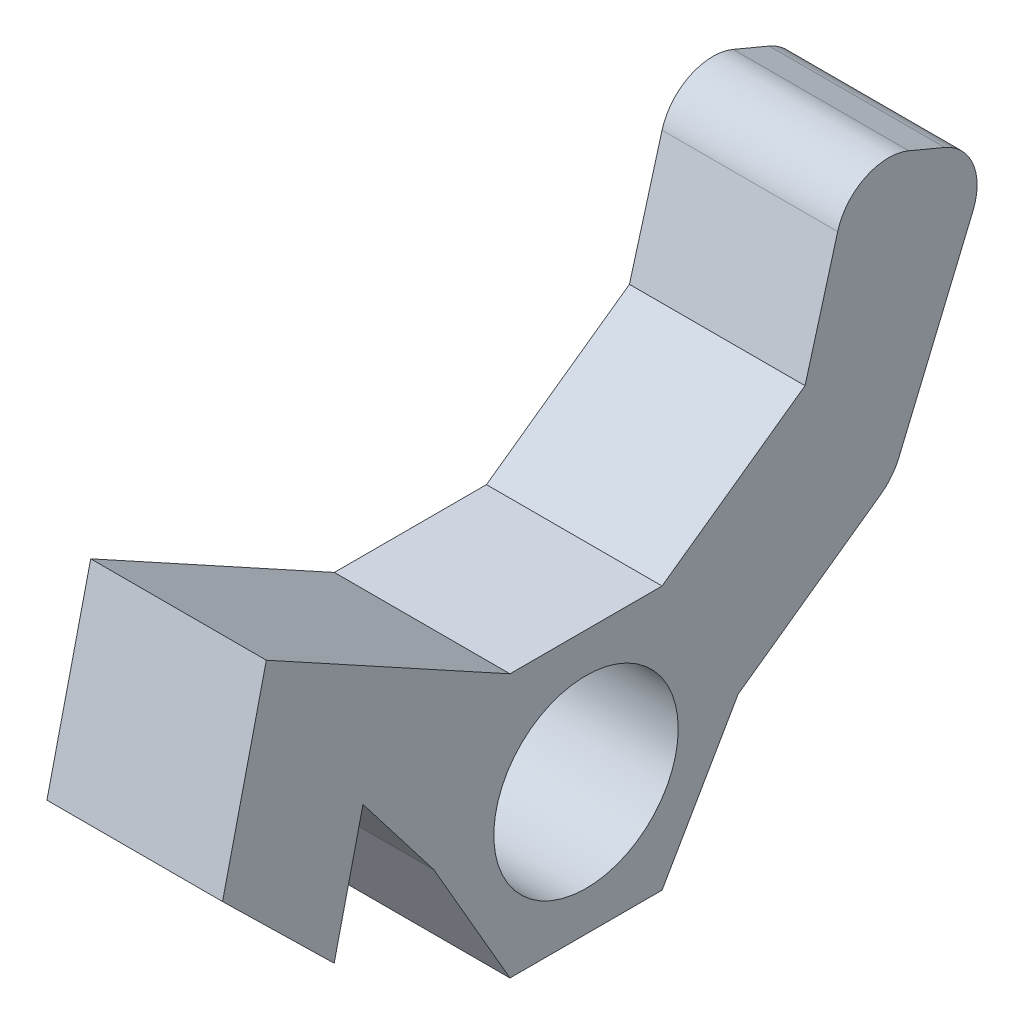
ISO-10303-21;
HEADER;
FILE_DESCRIPTION(('STEP AP214'),'2;1');
FILE_NAME('part.step','',(''),(''),'','','');
FILE_SCHEMA(('AUTOMOTIVE_DESIGN { 1 0 10303 214 1 1 1 1 }'));
ENDSEC;
DATA;
#1=APPLICATION_CONTEXT('core data for automotive mechanical design processes');
#2=APPLICATION_PROTOCOL_DEFINITION('international standard','automotive_design',2000,#1);
#3=PRODUCT_CONTEXT('',#1,'mechanical');
#4=PRODUCT('Part','Part','',(#3));
#5=PRODUCT_RELATED_PRODUCT_CATEGORY('part','',(#4));
#6=PRODUCT_DEFINITION_FORMATION('','',#4);
#7=PRODUCT_DEFINITION_CONTEXT('part definition',#1,'design');
#8=PRODUCT_DEFINITION('design','',#6,#7);
#9=PRODUCT_DEFINITION_SHAPE('','',#8);
#10=(LENGTH_UNIT() NAMED_UNIT(*) SI_UNIT(.MILLI.,.METRE.));
#11=(NAMED_UNIT(*) PLANE_ANGLE_UNIT() SI_UNIT($,.RADIAN.));
#12=(NAMED_UNIT(*) SI_UNIT($,.STERADIAN.) SOLID_ANGLE_UNIT());
#13=UNCERTAINTY_MEASURE_WITH_UNIT(LENGTH_MEASURE(1.E-05),#10,'distance_accuracy_value','');
#14=(GEOMETRIC_REPRESENTATION_CONTEXT(3) GLOBAL_UNCERTAINTY_ASSIGNED_CONTEXT((#13)) GLOBAL_UNIT_ASSIGNED_CONTEXT((#10,
#11,#12)) REPRESENTATION_CONTEXT('',''));
#15=CARTESIAN_POINT('',(0.,0.,0.));
#16=DIRECTION('',(0.,0.,1.));
#17=DIRECTION('',(1.,0.,0.));
#18=AXIS2_PLACEMENT_3D('',#15,#16,#17);
#19=CARTESIAN_POINT('',(4.,0.,0.));
#20=DIRECTION('',(1.,0.,0.));
#21=DIRECTION('',(0.,0.,-1.));
#22=AXIS2_PLACEMENT_3D('',#19,#20,#21);
#23=PLANE('',#22);
#24=DIRECTION('',(0.,-0.580651326789798,0.814152342437978));
#25=VECTOR('',#24,1.);
#26=CARTESIAN_POINT('',(4.,-1.63761467889908,-1.16794251703039));
#27=LINE('',#26,#25);
#28=CARTESIAN_POINT('',(4.,2.31721094970196,-6.71314736011672));
#29=VERTEX_POINT('',#28);
#30=CARTESIAN_POINT('',(4.,0.,-3.46410161513775));
#31=VERTEX_POINT('',#30);
#32=EDGE_CURVE('E177',#29,#31,#27,.T.);
#33=ORIENTED_EDGE('',*,*,#32,.F.);
#34=CARTESIAN_POINT('',(4.,3.29419376062754,-6.01636576796896));
#35=DIRECTION('',(1.,0.,0.));
#36=DIRECTION('',(0.,0.,-1.));
#37=AXIS2_PLACEMENT_3D('',#34,#35,#36);
#38=CIRCLE('',#37,1.2);
#39=CARTESIAN_POINT('',(4.,2.82977688229042,-7.12285434139193));
#40=VERTEX_POINT('',#39);
#41=EDGE_CURVE('E232',#29,#40,#38,.T.);
#42=ORIENTED_EDGE('',*,*,#41,.T.);
#43=DIRECTION('',(0.,0.922073811185813,-0.387014065280928));
#44=VECTOR('',#43,1.);
#45=CARTESIAN_POINT('',(4.,2.51526585761791,-6.99084734937289));
#46=LINE('',#45,#44);
#47=CARTESIAN_POINT('',(4.,6.85967567406385,-8.81428890460679));
#48=VERTEX_POINT('',#47);
#49=EDGE_CURVE('E251',#40,#48,#46,.T.);
#50=ORIENTED_EDGE('',*,*,#49,.T.);
#51=CARTESIAN_POINT('',(4.,7.32409255240096,-7.70780033118382));
#52=DIRECTION('',(1.,0.,0.));
#53=DIRECTION('',(0.,0.,-1.));
#54=AXIS2_PLACEMENT_3D('',#51,#52,#53);
#55=CIRCLE('',#54,1.2);
#56=CARTESIAN_POINT('',(4.,8.43058112582394,-8.17221720952093));
#57=VERTEX_POINT('',#56);
#58=EDGE_CURVE('E230',#48,#57,#55,.T.);
#59=ORIENTED_EDGE('',*,*,#58,.T.);
#60=DIRECTION('',(0.,0.387014065280928,0.922073811185813));
#61=VECTOR('',#60,1.);
#62=CARTESIAN_POINT('',(4.,7.96616424748682,-9.27870578294391));
#63=LINE('',#62,#61);
#64=CARTESIAN_POINT('',(4.,8.77462665925595,-7.35251734666754));
#65=VERTEX_POINT('',#64);
#66=EDGE_CURVE('E167',#57,#65,#63,.T.);
#67=ORIENTED_EDGE('',*,*,#66,.T.);
#68=CARTESIAN_POINT('',(4.,7.66813808583297,-6.88810046833043));
#69=DIRECTION('',(1.,0.,0.));
#70=DIRECTION('',(0.,0.,-1.));
#71=AXIS2_PLACEMENT_3D('',#68,#69,#70);
#72=CIRCLE('',#71,1.2);
#73=CARTESIAN_POINT('',(4.,7.99030331336445,-5.73215515553678));
#74=VERTEX_POINT('',#73);
#75=EDGE_CURVE('E162',#65,#74,#72,.T.);
#76=ORIENTED_EDGE('',*,*,#75,.T.);
#77=DIRECTION('',(0.,-0.963287760661368,0.268471022942901));
#78=VECTOR('',#77,1.);
#79=CARTESIAN_POINT('',(4.,9.30136277270602,-6.09755113435285));
#80=LINE('',#79,#78);
#81=CARTESIAN_POINT('',(4.,5.3226053071592,-4.98866017732079));
#82=VERTEX_POINT('',#81);
#83=EDGE_CURVE('E156',#74,#82,#80,.T.);
#84=ORIENTED_EDGE('',*,*,#83,.T.);
#85=DIRECTION('',(0.,0.580651326789799,-0.814152342437978));
#86=VECTOR('',#85,1.);
#87=CARTESIAN_POINT('',(4.,1.1697247706422,0.834244655021708));
#88=LINE('',#87,#86);
#89=CARTESIAN_POINT('',(4.,3.,-1.73205080756888));
#90=VERTEX_POINT('',#89);
#91=EDGE_CURVE('E160',#90,#82,#88,.T.);
#92=ORIENTED_EDGE('',*,*,#91,.F.);
#93=DIRECTION('',(0.,0.,1.));
#94=VECTOR('',#93,1.);
#95=CARTESIAN_POINT('',(4.,3.,-1.73205080756888));
#96=LINE('',#95,#94);
#97=CARTESIAN_POINT('',(4.,3.,1.73205080756888));
#98=VERTEX_POINT('',#97);
#99=EDGE_CURVE('E197',#90,#98,#96,.T.);
#100=ORIENTED_EDGE('',*,*,#99,.T.);
#101=DIRECTION('',(0.,-0.480833999578843,-0.876811647304604));
#102=VECTOR('',#101,1.);
#103=CARTESIAN_POINT('',(4.,1.57616189966639,-0.864350094493091));
#104=LINE('',#103,#102);
#105=CARTESIAN_POINT('',(4.,6.04314808135633,7.28129999656755));
#106=VERTEX_POINT('',#105);
#107=EDGE_CURVE('E269',#106,#98,#104,.T.);
#108=ORIENTED_EDGE('',*,*,#107,.F.);
#109=DIRECTION('',(0.,0.973692519233933,-0.227865921076139));
#110=VECTOR('',#109,1.);
#111=CARTESIAN_POINT('',(4.,1.9292894476235,8.24403532444095));
#112=LINE('',#111,#110);
#113=CARTESIAN_POINT('',(4.,1.78076467336461,8.27879345785637));
#114=VERTEX_POINT('',#113);
#115=EDGE_CURVE('E272',#114,#106,#112,.T.);
#116=ORIENTED_EDGE('',*,*,#115,.F.);
#117=DIRECTION('',(0.,0.699271931018906,0.71485576621378));
#118=VECTOR('',#117,1.);
#119=CARTESIAN_POINT('',(4.,-3.22838728513977,3.15800853494332));
#120=LINE('',#119,#118);
#121=CARTESIAN_POINT('',(4.,-0.70638785207229,5.73621274584197));
#122=VERTEX_POINT('',#121);
#123=EDGE_CURVE('E274',#122,#114,#120,.T.);
#124=ORIENTED_EDGE('',*,*,#123,.F.);
#125=DIRECTION('',(0.,-0.973692519233933,0.227865921076139));
#126=VECTOR('',#125,1.);
#127=CARTESIAN_POINT('',(4.,1.23602353390806,5.28164485009247));
#128=LINE('',#127,#126);
#129=CARTESIAN_POINT('',(4.,2.09763278058422,5.08000893246619));
#130=VERTEX_POINT('',#129);
#131=EDGE_CURVE('E276',#130,#122,#128,.T.);
#132=ORIENTED_EDGE('',*,*,#131,.F.);
#133=DIRECTION('',(0.,0.792196048817041,0.610266679607095));
#134=VECTOR('',#133,1.);
#135=CARTESIAN_POINT('',(4.,-1.67472287832484,2.17398211537063));
#136=LINE('',#135,#134);
#137=CARTESIAN_POINT('',(4.,0.,3.46410161513776));
#138=VERTEX_POINT('',#137);
#139=EDGE_CURVE('E260',#138,#130,#136,.T.);
#140=ORIENTED_EDGE('',*,*,#139,.F.);
#141=DIRECTION('',(0.,-0.866025403784439,-0.5));
#142=VECTOR('',#141,1.);
#143=CARTESIAN_POINT('',(4.,0.,3.46410161513776));
#144=LINE('',#143,#142);
#145=CARTESIAN_POINT('',(4.,-3.,1.73205080756888));
#146=VERTEX_POINT('',#145);
#147=EDGE_CURVE('E200',#138,#146,#144,.T.);
#148=ORIENTED_EDGE('',*,*,#147,.T.);
#149=DIRECTION('',(0.,0.,-1.));
#150=VECTOR('',#149,1.);
#151=CARTESIAN_POINT('',(4.,-3.,1.73205080756888));
#152=LINE('',#151,#150);
#153=CARTESIAN_POINT('',(4.,-3.,-1.73205080756888));
#154=VERTEX_POINT('',#153);
#155=EDGE_CURVE('E202',#146,#154,#152,.T.);
#156=ORIENTED_EDGE('',*,*,#155,.T.);
#157=DIRECTION('',(0.,0.866025403784439,-0.5));
#158=VECTOR('',#157,1.);
#159=CARTESIAN_POINT('',(4.,-3.,-1.73205080756888));
#160=LINE('',#159,#158);
#161=EDGE_CURVE('E194',#154,#31,#160,.T.);
#162=ORIENTED_EDGE('',*,*,#161,.T.);
#163=EDGE_LOOP('',(#33,#42,#50,#59,#67,#76,#84,#92,#100,#108,#116,#124,#132,#140,#148,#156,#162));
#164=FACE_BOUND('',#163,.T.);
#165=CARTESIAN_POINT('',(4.,0.,0.));
#166=DIRECTION('',(1.,0.,0.));
#167=DIRECTION('',(0.,0.,-1.));
#168=AXIS2_PLACEMENT_3D('',#165,#166,#167);
#169=CIRCLE('',#168,2.1);
#170=CARTESIAN_POINT('',(4.,0.,-2.1));
#171=VERTEX_POINT('',#170);
#172=EDGE_CURVE('E186',#171,#171,#169,.T.);
#173=ORIENTED_EDGE('',*,*,#172,.F.);
#174=EDGE_LOOP('',(#173));
#175=FACE_BOUND('',#174,.T.);
#176=ADVANCED_FACE('F37',(#164,#175),#23,.T.);
#177=CARTESIAN_POINT('',(0.,0.,0.));
#178=DIRECTION('',(1.,0.,0.));
#179=DIRECTION('',(0.,0.,-1.));
#180=AXIS2_PLACEMENT_3D('',#177,#178,#179);
#181=PLANE('',#180);
#182=DIRECTION('',(0.,0.922073811185813,-0.387014065280928));
#183=VECTOR('',#182,1.);
#184=CARTESIAN_POINT('',(0.,2.51526585761791,-6.99084734937289));
#185=LINE('',#184,#183);
#186=CARTESIAN_POINT('',(0.,2.82977688229042,-7.12285434139193));
#187=VERTEX_POINT('',#186);
#188=CARTESIAN_POINT('',(0.,6.85967567406385,-8.81428890460679));
#189=VERTEX_POINT('',#188);
#190=EDGE_CURVE('E166',#187,#189,#185,.T.);
#191=ORIENTED_EDGE('',*,*,#190,.F.);
#192=CARTESIAN_POINT('',(0.,3.29419376062754,-6.01636576796896));
#193=DIRECTION('',(1.,0.,0.));
#194=DIRECTION('',(0.,0.,-1.));
#195=AXIS2_PLACEMENT_3D('',#192,#193,#194);
#196=CIRCLE('',#195,1.2);
#197=CARTESIAN_POINT('',(0.,2.31721094970196,-6.71314736011672));
#198=VERTEX_POINT('',#197);
#199=EDGE_CURVE('E242',#187,#198,#196,.F.);
#200=ORIENTED_EDGE('',*,*,#199,.T.);
#201=DIRECTION('',(0.,-0.580651326789798,0.814152342437978));
#202=VECTOR('',#201,1.);
#203=CARTESIAN_POINT('',(0.,-1.63761467889908,-1.16794251703039));
#204=LINE('',#203,#202);
#205=CARTESIAN_POINT('',(0.,0.,-3.46410161513775));
#206=VERTEX_POINT('',#205);
#207=EDGE_CURVE('E176',#198,#206,#204,.T.);
#208=ORIENTED_EDGE('',*,*,#207,.T.);
#209=DIRECTION('',(0.,0.866025403784439,-0.5));
#210=VECTOR('',#209,1.);
#211=CARTESIAN_POINT('',(0.,-3.,-1.73205080756888));
#212=LINE('',#211,#210);
#213=CARTESIAN_POINT('',(0.,-3.,-1.73205080756888));
#214=VERTEX_POINT('',#213);
#215=EDGE_CURVE('E192',#214,#206,#212,.T.);
#216=ORIENTED_EDGE('',*,*,#215,.F.);
#217=DIRECTION('',(0.,0.,-1.));
#218=VECTOR('',#217,1.);
#219=CARTESIAN_POINT('',(0.,-3.,1.73205080756888));
#220=LINE('',#219,#218);
#221=CARTESIAN_POINT('',(0.,-3.,1.73205080756888));
#222=VERTEX_POINT('',#221);
#223=EDGE_CURVE('E198',#222,#214,#220,.T.);
#224=ORIENTED_EDGE('',*,*,#223,.F.);
#225=DIRECTION('',(0.,-0.866025403784439,-0.5));
#226=VECTOR('',#225,1.);
#227=CARTESIAN_POINT('',(0.,0.,3.46410161513776));
#228=LINE('',#227,#226);
#229=CARTESIAN_POINT('',(0.,0.,3.46410161513776));
#230=VERTEX_POINT('',#229);
#231=EDGE_CURVE('E209',#230,#222,#228,.T.);
#232=ORIENTED_EDGE('',*,*,#231,.F.);
#233=DIRECTION('',(0.,0.792196048817041,0.610266679607095));
#234=VECTOR('',#233,1.);
#235=CARTESIAN_POINT('',(0.,-1.67472287832484,2.17398211537063));
#236=LINE('',#235,#234);
#237=CARTESIAN_POINT('',(0.,2.09763278058422,5.08000893246619));
#238=VERTEX_POINT('',#237);
#239=EDGE_CURVE('E266',#230,#238,#236,.T.);
#240=ORIENTED_EDGE('',*,*,#239,.T.);
#241=DIRECTION('',(0.,-0.973692519233933,0.227865921076139));
#242=VECTOR('',#241,1.);
#243=CARTESIAN_POINT('',(0.,1.23602353390806,5.28164485009247));
#244=LINE('',#243,#242);
#245=CARTESIAN_POINT('',(0.,-0.70638785207229,5.73621274584197));
#246=VERTEX_POINT('',#245);
#247=EDGE_CURVE('E264',#238,#246,#244,.T.);
#248=ORIENTED_EDGE('',*,*,#247,.T.);
#249=DIRECTION('',(0.,0.699271931018906,0.71485576621378));
#250=VECTOR('',#249,1.);
#251=CARTESIAN_POINT('',(0.,-3.22838728513977,3.15800853494332));
#252=LINE('',#251,#250);
#253=CARTESIAN_POINT('',(0.,1.78076467336461,8.27879345785637));
#254=VERTEX_POINT('',#253);
#255=EDGE_CURVE('E262',#246,#254,#252,.T.);
#256=ORIENTED_EDGE('',*,*,#255,.T.);
#257=DIRECTION('',(0.,0.973692519233933,-0.227865921076139));
#258=VECTOR('',#257,1.);
#259=CARTESIAN_POINT('',(0.,1.9292894476235,8.24403532444095));
#260=LINE('',#259,#258);
#261=CARTESIAN_POINT('',(0.,6.04314808135633,7.28129999656755));
#262=VERTEX_POINT('',#261);
#263=EDGE_CURVE('E259',#254,#262,#260,.T.);
#264=ORIENTED_EDGE('',*,*,#263,.T.);
#265=DIRECTION('',(0.,-0.480833999578843,-0.876811647304604));
#266=VECTOR('',#265,1.);
#267=CARTESIAN_POINT('',(0.,1.57616189966639,-0.864350094493091));
#268=LINE('',#267,#266);
#269=CARTESIAN_POINT('',(0.,3.,1.73205080756888));
#270=VERTEX_POINT('',#269);
#271=EDGE_CURVE('E256',#262,#270,#268,.T.);
#272=ORIENTED_EDGE('',*,*,#271,.T.);
#273=DIRECTION('',(0.,0.,1.));
#274=VECTOR('',#273,1.);
#275=CARTESIAN_POINT('',(0.,3.,-1.73205080756888));
#276=LINE('',#275,#274);
#277=CARTESIAN_POINT('',(0.,3.,-1.73205080756888));
#278=VERTEX_POINT('',#277);
#279=EDGE_CURVE('E207',#278,#270,#276,.T.);
#280=ORIENTED_EDGE('',*,*,#279,.F.);
#281=DIRECTION('',(0.,0.580651326789799,-0.814152342437978));
#282=VECTOR('',#281,1.);
#283=CARTESIAN_POINT('',(0.,1.1697247706422,0.834244655021708));
#284=LINE('',#283,#282);
#285=CARTESIAN_POINT('',(0.,5.3226053071592,-4.98866017732079));
#286=VERTEX_POINT('',#285);
#287=EDGE_CURVE('E183',#278,#286,#284,.T.);
#288=ORIENTED_EDGE('',*,*,#287,.T.);
#289=DIRECTION('',(0.,-0.963287760661368,0.268471022942901));
#290=VECTOR('',#289,1.);
#291=CARTESIAN_POINT('',(0.,9.30136277270602,-6.09755113435285));
#292=LINE('',#291,#290);
#293=CARTESIAN_POINT('',(0.,7.99030331336445,-5.73215515553678));
#294=VERTEX_POINT('',#293);
#295=EDGE_CURVE('E180',#294,#286,#292,.T.);
#296=ORIENTED_EDGE('',*,*,#295,.F.);
#297=CARTESIAN_POINT('',(0.,7.66813808583297,-6.88810046833043));
#298=DIRECTION('',(1.,0.,0.));
#299=DIRECTION('',(0.,0.,-1.));
#300=AXIS2_PLACEMENT_3D('',#297,#298,#299);
#301=CIRCLE('',#300,1.2);
#302=CARTESIAN_POINT('',(0.,8.77462665925595,-7.35251734666754));
#303=VERTEX_POINT('',#302);
#304=EDGE_CURVE('E52',#294,#303,#301,.F.);
#305=ORIENTED_EDGE('',*,*,#304,.T.);
#306=DIRECTION('',(0.,0.387014065280928,0.922073811185813));
#307=VECTOR('',#306,1.);
#308=CARTESIAN_POINT('',(0.,7.96616424748682,-9.27870578294391));
#309=LINE('',#308,#307);
#310=CARTESIAN_POINT('',(0.,8.43058112582394,-8.17221720952093));
#311=VERTEX_POINT('',#310);
#312=EDGE_CURVE('E248',#311,#303,#309,.T.);
#313=ORIENTED_EDGE('',*,*,#312,.F.);
#314=CARTESIAN_POINT('',(0.,7.32409255240096,-7.70780033118382));
#315=DIRECTION('',(1.,0.,0.));
#316=DIRECTION('',(0.,0.,-1.));
#317=AXIS2_PLACEMENT_3D('',#314,#315,#316);
#318=CIRCLE('',#317,1.2);
#319=EDGE_CURVE('E240',#311,#189,#318,.F.);
#320=ORIENTED_EDGE('',*,*,#319,.T.);
#321=EDGE_LOOP('',(#191,#200,#208,#216,#224,#232,#240,#248,#256,#264,#272,#280,#288,#296,#305,
#313,#320));
#322=FACE_BOUND('',#321,.T.);
#323=CARTESIAN_POINT('',(0.,0.,0.));
#324=DIRECTION('',(1.,0.,0.));
#325=DIRECTION('',(0.,0.,-1.));
#326=AXIS2_PLACEMENT_3D('',#323,#324,#325);
#327=CIRCLE('',#326,2.1);
#328=CARTESIAN_POINT('',(0.,0.,-2.1));
#329=VERTEX_POINT('',#328);
#330=EDGE_CURVE('E182',#329,#329,#327,.T.);
#331=ORIENTED_EDGE('',*,*,#330,.T.);
#332=EDGE_LOOP('',(#331));
#333=FACE_BOUND('',#332,.T.);
#334=ADVANCED_FACE('F303',(#322,#333),#181,.F.);
#335=CARTESIAN_POINT('',(4.,-3.,-1.73205080756888));
#336=DIRECTION('',(0.,0.5,0.866025403784439));
#337=DIRECTION('',(0.,-0.866025403784439,0.5));
#338=AXIS2_PLACEMENT_3D('',#335,#336,#337);
#339=PLANE('',#338);
#340=ORIENTED_EDGE('',*,*,#215,.T.);
#341=DIRECTION('',(-1.,0.,0.));
#342=VECTOR('',#341,1.);
#343=CARTESIAN_POINT('',(4.,0.,-3.46410161513775));
#344=LINE('',#343,#342);
#345=EDGE_CURVE('E223',#31,#206,#344,.T.);
#346=ORIENTED_EDGE('',*,*,#345,.F.);
#347=ORIENTED_EDGE('',*,*,#161,.F.);
#348=DIRECTION('',(-1.,0.,0.));
#349=VECTOR('',#348,1.);
#350=CARTESIAN_POINT('',(4.,-3.,-1.73205080756888));
#351=LINE('',#350,#349);
#352=EDGE_CURVE('E204',#154,#214,#351,.T.);
#353=ORIENTED_EDGE('',*,*,#352,.T.);
#354=EDGE_LOOP('',(#340,#346,#347,#353));
#355=FACE_BOUND('',#354,.T.);
#356=ADVANCED_FACE('F299',(#355),#339,.F.);
#357=CARTESIAN_POINT('',(4.,3.,-1.73205080756888));
#358=DIRECTION('',(0.,-1.,0.));
#359=DIRECTION('',(0.,0.,-1.));
#360=AXIS2_PLACEMENT_3D('',#357,#358,#359);
#361=PLANE('',#360);
#362=ORIENTED_EDGE('',*,*,#279,.T.);
#363=DIRECTION('',(-1.,0.,0.));
#364=VECTOR('',#363,1.);
#365=CARTESIAN_POINT('',(4.,3.,1.73205080756888));
#366=LINE('',#365,#364);
#367=EDGE_CURVE('E219',#98,#270,#366,.T.);
#368=ORIENTED_EDGE('',*,*,#367,.F.);
#369=ORIENTED_EDGE('',*,*,#99,.F.);
#370=DIRECTION('',(-1.,0.,0.));
#371=VECTOR('',#370,1.);
#372=CARTESIAN_POINT('',(4.,3.,-1.73205080756888));
#373=LINE('',#372,#371);
#374=EDGE_CURVE('E175',#90,#278,#373,.T.);
#375=ORIENTED_EDGE('',*,*,#374,.T.);
#376=EDGE_LOOP('',(#362,#368,#369,#375));
#377=FACE_BOUND('',#376,.T.);
#378=ADVANCED_FACE('F343',(#377),#361,.F.);
#379=CARTESIAN_POINT('',(4.,0.,3.46410161513776));
#380=DIRECTION('',(0.,0.5,-0.866025403784439));
#381=DIRECTION('',(0.,0.866025403784439,0.5));
#382=AXIS2_PLACEMENT_3D('',#379,#380,#381);
#383=PLANE('',#382);
#384=ORIENTED_EDGE('',*,*,#231,.T.);
#385=DIRECTION('',(-1.,0.,0.));
#386=VECTOR('',#385,1.);
#387=CARTESIAN_POINT('',(4.,-3.,1.73205080756888));
#388=LINE('',#387,#386);
#389=EDGE_CURVE('E214',#146,#222,#388,.T.);
#390=ORIENTED_EDGE('',*,*,#389,.F.);
#391=ORIENTED_EDGE('',*,*,#147,.F.);
#392=DIRECTION('',(-1.,0.,0.));
#393=VECTOR('',#392,1.);
#394=CARTESIAN_POINT('',(4.,0.,3.46410161513776));
#395=LINE('',#394,#393);
#396=EDGE_CURVE('E217',#138,#230,#395,.T.);
#397=ORIENTED_EDGE('',*,*,#396,.T.);
#398=EDGE_LOOP('',(#384,#390,#391,#397));
#399=FACE_BOUND('',#398,.T.);
#400=ADVANCED_FACE('F339',(#399),#383,.F.);
#401=CARTESIAN_POINT('',(4.,-3.,1.73205080756888));
#402=DIRECTION('',(0.,1.,0.));
#403=DIRECTION('',(0.,0.,1.));
#404=AXIS2_PLACEMENT_3D('',#401,#402,#403);
#405=PLANE('',#404);
#406=ORIENTED_EDGE('',*,*,#223,.T.);
#407=ORIENTED_EDGE('',*,*,#352,.F.);
#408=ORIENTED_EDGE('',*,*,#155,.F.);
#409=ORIENTED_EDGE('',*,*,#389,.T.);
#410=EDGE_LOOP('',(#406,#407,#408,#409));
#411=FACE_BOUND('',#410,.T.);
#412=ADVANCED_FACE('F336',(#411),#405,.F.);
#413=CARTESIAN_POINT('',(4.,0.,0.));
#414=DIRECTION('',(-1.,0.,0.));
#415=DIRECTION('',(0.,0.,1.));
#416=AXIS2_PLACEMENT_3D('',#413,#414,#415);
#417=CYLINDRICAL_SURFACE('',#416,2.1);
#418=ORIENTED_EDGE('',*,*,#172,.T.);
#419=EDGE_LOOP('',(#418));
#420=FACE_BOUND('',#419,.T.);
#421=ORIENTED_EDGE('',*,*,#330,.F.);
#422=EDGE_LOOP('',(#421));
#423=FACE_BOUND('',#422,.T.);
#424=ADVANCED_FACE('F333',(#420,#423),#417,.F.);
#425=CARTESIAN_POINT('',(0.,-1.63761467889908,-1.16794251703039));
#426=DIRECTION('',(0.,0.814152342437978,0.580651326789798));
#427=DIRECTION('',(0.,-0.580651326789798,0.814152342437978));
#428=AXIS2_PLACEMENT_3D('',#425,#426,#427);
#429=PLANE('',#428);
#430=ORIENTED_EDGE('',*,*,#207,.F.);
#431=DIRECTION('',(1.,0.,0.));
#432=VECTOR('',#431,1.);
#433=CARTESIAN_POINT('',(4.,2.31721094970196,-6.71314736011672));
#434=LINE('',#433,#432);
#435=EDGE_CURVE('E226',#198,#29,#434,.T.);
#436=ORIENTED_EDGE('',*,*,#435,.T.);
#437=ORIENTED_EDGE('',*,*,#32,.T.);
#438=ORIENTED_EDGE('',*,*,#345,.T.);
#439=EDGE_LOOP('',(#430,#436,#437,#438));
#440=FACE_BOUND('',#439,.T.);
#441=ADVANCED_FACE('F292',(#440),#429,.F.);
#442=CARTESIAN_POINT('',(0.,1.1697247706422,0.834244655021708));
#443=DIRECTION('',(0.,-0.814152342437978,-0.580651326789799));
#444=DIRECTION('',(0.,0.580651326789799,-0.814152342437978));
#445=AXIS2_PLACEMENT_3D('',#442,#443,#444);
#446=PLANE('',#445);
#447=ORIENTED_EDGE('',*,*,#91,.T.);
#448=DIRECTION('',(1.,0.,0.));
#449=VECTOR('',#448,1.);
#450=CARTESIAN_POINT('',(0.,5.3226053071592,-4.98866017732079));
#451=LINE('',#450,#449);
#452=EDGE_CURVE('E174',#286,#82,#451,.T.);
#453=ORIENTED_EDGE('',*,*,#452,.F.);
#454=ORIENTED_EDGE('',*,*,#287,.F.);
#455=ORIENTED_EDGE('',*,*,#374,.F.);
#456=EDGE_LOOP('',(#447,#453,#454,#455));
#457=FACE_BOUND('',#456,.T.);
#458=ADVANCED_FACE('F172',(#457),#446,.F.);
#459=CARTESIAN_POINT('',(0.,1.57616189966639,-0.864350094493091));
#460=DIRECTION('',(0.,-0.876811647304604,0.480833999578843));
#461=DIRECTION('',(0.,-0.480833999578843,-0.876811647304604));
#462=AXIS2_PLACEMENT_3D('',#459,#460,#461);
#463=PLANE('',#462);
#464=ORIENTED_EDGE('',*,*,#107,.T.);
#465=ORIENTED_EDGE('',*,*,#367,.T.);
#466=ORIENTED_EDGE('',*,*,#271,.F.);
#467=DIRECTION('',(1.,0.,0.));
#468=VECTOR('',#467,1.);
#469=CARTESIAN_POINT('',(0.,6.04314808135633,7.28129999656755));
#470=LINE('',#469,#468);
#471=EDGE_CURVE('E268',#262,#106,#470,.T.);
#472=ORIENTED_EDGE('',*,*,#471,.T.);
#473=EDGE_LOOP('',(#464,#465,#466,#472));
#474=FACE_BOUND('',#473,.T.);
#475=ADVANCED_FACE('F384',(#474),#463,.F.);
#476=CARTESIAN_POINT('',(0.,-1.67472287832484,2.17398211537063));
#477=DIRECTION('',(0.,0.610266679607095,-0.792196048817041));
#478=DIRECTION('',(0.,0.792196048817041,0.610266679607095));
#479=AXIS2_PLACEMENT_3D('',#476,#477,#478);
#480=PLANE('',#479);
#481=ORIENTED_EDGE('',*,*,#139,.T.);
#482=DIRECTION('',(1.,0.,0.));
#483=VECTOR('',#482,1.);
#484=CARTESIAN_POINT('',(0.,2.09763278058422,5.08000893246619));
#485=LINE('',#484,#483);
#486=EDGE_CURVE('E279',#238,#130,#485,.T.);
#487=ORIENTED_EDGE('',*,*,#486,.F.);
#488=ORIENTED_EDGE('',*,*,#239,.F.);
#489=ORIENTED_EDGE('',*,*,#396,.F.);
#490=EDGE_LOOP('',(#481,#487,#488,#489));
#491=FACE_BOUND('',#490,.T.);
#492=ADVANCED_FACE('F391',(#491),#480,.F.);
#493=CARTESIAN_POINT('',(0.,1.23602353390806,5.28164485009247));
#494=DIRECTION('',(0.,0.227865921076139,0.973692519233933));
#495=DIRECTION('',(0.,-0.973692519233933,0.227865921076139));
#496=AXIS2_PLACEMENT_3D('',#493,#494,#495);
#497=PLANE('',#496);
#498=ORIENTED_EDGE('',*,*,#131,.T.);
#499=DIRECTION('',(1.,0.,0.));
#500=VECTOR('',#499,1.);
#501=CARTESIAN_POINT('',(0.,-0.70638785207229,5.73621274584197));
#502=LINE('',#501,#500);
#503=EDGE_CURVE('E282',#246,#122,#502,.T.);
#504=ORIENTED_EDGE('',*,*,#503,.F.);
#505=ORIENTED_EDGE('',*,*,#247,.F.);
#506=ORIENTED_EDGE('',*,*,#486,.T.);
#507=EDGE_LOOP('',(#498,#504,#505,#506));
#508=FACE_BOUND('',#507,.T.);
#509=ADVANCED_FACE('F399',(#508),#497,.F.);
#510=CARTESIAN_POINT('',(0.,-3.22838728513977,3.15800853494332));
#511=DIRECTION('',(0.,0.71485576621378,-0.699271931018906));
#512=DIRECTION('',(0.,0.699271931018906,0.71485576621378));
#513=AXIS2_PLACEMENT_3D('',#510,#511,#512);
#514=PLANE('',#513);
#515=ORIENTED_EDGE('',*,*,#123,.T.);
#516=DIRECTION('',(1.,0.,0.));
#517=VECTOR('',#516,1.);
#518=CARTESIAN_POINT('',(0.,1.78076467336461,8.27879345785637));
#519=LINE('',#518,#517);
#520=EDGE_CURVE('E285',#254,#114,#519,.T.);
#521=ORIENTED_EDGE('',*,*,#520,.F.);
#522=ORIENTED_EDGE('',*,*,#255,.F.);
#523=ORIENTED_EDGE('',*,*,#503,.T.);
#524=EDGE_LOOP('',(#515,#521,#522,#523));
#525=FACE_BOUND('',#524,.T.);
#526=ADVANCED_FACE('F407',(#525),#514,.F.);
#527=CARTESIAN_POINT('',(0.,1.9292894476235,8.24403532444095));
#528=DIRECTION('',(0.,-0.227865921076139,-0.973692519233933));
#529=DIRECTION('',(0.,0.973692519233933,-0.227865921076139));
#530=AXIS2_PLACEMENT_3D('',#527,#528,#529);
#531=PLANE('',#530);
#532=ORIENTED_EDGE('',*,*,#115,.T.);
#533=ORIENTED_EDGE('',*,*,#471,.F.);
#534=ORIENTED_EDGE('',*,*,#263,.F.);
#535=ORIENTED_EDGE('',*,*,#520,.T.);
#536=EDGE_LOOP('',(#532,#533,#534,#535));
#537=FACE_BOUND('',#536,.T.);
#538=ADVANCED_FACE('F415',(#537),#531,.F.);
#539=CARTESIAN_POINT('',(0.,9.30136277270602,-6.09755113435285));
#540=DIRECTION('',(0.,0.268471022942901,0.963287760661368));
#541=DIRECTION('',(0.,-0.963287760661368,0.268471022942901));
#542=AXIS2_PLACEMENT_3D('',#539,#540,#541);
#543=PLANE('',#542);
#544=ORIENTED_EDGE('',*,*,#83,.F.);
#545=DIRECTION('',(1.,0.,0.));
#546=VECTOR('',#545,1.);
#547=CARTESIAN_POINT('',(0.,7.99030331336445,-5.73215515553678));
#548=LINE('',#547,#546);
#549=EDGE_CURVE('E11',#74,#294,#548,.F.);
#550=ORIENTED_EDGE('',*,*,#549,.T.);
#551=ORIENTED_EDGE('',*,*,#295,.T.);
#552=ORIENTED_EDGE('',*,*,#452,.T.);
#553=EDGE_LOOP('',(#544,#550,#551,#552));
#554=FACE_BOUND('',#553,.T.);
#555=ADVANCED_FACE('F179',(#554),#543,.T.);
#556=CARTESIAN_POINT('',(0.,7.96616424748682,-9.27870578294391));
#557=DIRECTION('',(0.,0.922073811185813,-0.387014065280928));
#558=DIRECTION('',(0.,0.387014065280928,0.922073811185813));
#559=AXIS2_PLACEMENT_3D('',#556,#557,#558);
#560=PLANE('',#559);
#561=ORIENTED_EDGE('',*,*,#66,.F.);
#562=DIRECTION('',(1.,0.,0.));
#563=VECTOR('',#562,1.);
#564=CARTESIAN_POINT('',(0.,8.43058112582394,-8.17221720952093));
#565=LINE('',#564,#563);
#566=EDGE_CURVE('E45',#57,#311,#565,.F.);
#567=ORIENTED_EDGE('',*,*,#566,.T.);
#568=ORIENTED_EDGE('',*,*,#312,.T.);
#569=DIRECTION('',(1.,0.,0.));
#570=VECTOR('',#569,1.);
#571=CARTESIAN_POINT('',(0.,8.77462665925595,-7.35251734666754));
#572=LINE('',#571,#570);
#573=EDGE_CURVE('E244',#303,#65,#572,.T.);
#574=ORIENTED_EDGE('',*,*,#573,.T.);
#575=EDGE_LOOP('',(#561,#567,#568,#574));
#576=FACE_BOUND('',#575,.T.);
#577=ADVANCED_FACE('F247',(#576),#560,.T.);
#578=CARTESIAN_POINT('',(0.,2.51526585761791,-6.99084734937289));
#579=DIRECTION('',(0.,-0.387014065280928,-0.922073811185813));
#580=DIRECTION('',(0.,0.922073811185813,-0.387014065280928));
#581=AXIS2_PLACEMENT_3D('',#578,#579,#580);
#582=PLANE('',#581);
#583=ORIENTED_EDGE('',*,*,#49,.F.);
#584=DIRECTION('',(1.,0.,0.));
#585=VECTOR('',#584,1.);
#586=CARTESIAN_POINT('',(0.,2.82977688229042,-7.12285434139193));
#587=LINE('',#586,#585);
#588=EDGE_CURVE('E237',#40,#187,#587,.F.);
#589=ORIENTED_EDGE('',*,*,#588,.T.);
#590=ORIENTED_EDGE('',*,*,#190,.T.);
#591=DIRECTION('',(1.,0.,0.));
#592=VECTOR('',#591,1.);
#593=CARTESIAN_POINT('',(0.,6.85967567406385,-8.81428890460679));
#594=LINE('',#593,#592);
#595=EDGE_CURVE('E234',#189,#48,#594,.T.);
#596=ORIENTED_EDGE('',*,*,#595,.T.);
#597=EDGE_LOOP('',(#583,#589,#590,#596));
#598=FACE_BOUND('',#597,.T.);
#599=ADVANCED_FACE('F312',(#598),#582,.T.);
#600=CARTESIAN_POINT('',(0.,3.29419376062754,-6.01636576796896));
#601=DIRECTION('',(-1.,0.,0.));
#602=DIRECTION('',(0.,0.,1.));
#603=AXIS2_PLACEMENT_3D('',#600,#601,#602);
#604=CYLINDRICAL_SURFACE('',#603,1.2);
#605=ORIENTED_EDGE('',*,*,#199,.F.);
#606=ORIENTED_EDGE('',*,*,#588,.F.);
#607=ORIENTED_EDGE('',*,*,#41,.F.);
#608=ORIENTED_EDGE('',*,*,#435,.F.);
#609=EDGE_LOOP('',(#605,#606,#607,#608));
#610=FACE_BOUND('',#609,.T.);
#611=ADVANCED_FACE('F308',(#610),#604,.T.);
#612=CARTESIAN_POINT('',(0.,7.32409255240096,-7.70780033118382));
#613=DIRECTION('',(1.,0.,0.));
#614=DIRECTION('',(0.,0.,-1.));
#615=AXIS2_PLACEMENT_3D('',#612,#613,#614);
#616=CYLINDRICAL_SURFACE('',#615,1.2);
#617=ORIENTED_EDGE('',*,*,#319,.F.);
#618=ORIENTED_EDGE('',*,*,#566,.F.);
#619=ORIENTED_EDGE('',*,*,#58,.F.);
#620=ORIENTED_EDGE('',*,*,#595,.F.);
#621=EDGE_LOOP('',(#617,#618,#619,#620));
#622=FACE_BOUND('',#621,.T.);
#623=ADVANCED_FACE('F317',(#622),#616,.T.);
#624=CARTESIAN_POINT('',(0.,7.66813808583297,-6.88810046833043));
#625=DIRECTION('',(1.,0.,0.));
#626=DIRECTION('',(0.,0.,-1.));
#627=AXIS2_PLACEMENT_3D('',#624,#625,#626);
#628=CYLINDRICAL_SURFACE('',#627,1.2);
#629=ORIENTED_EDGE('',*,*,#304,.F.);
#630=ORIENTED_EDGE('',*,*,#549,.F.);
#631=ORIENTED_EDGE('',*,*,#75,.F.);
#632=ORIENTED_EDGE('',*,*,#573,.F.);
#633=EDGE_LOOP('',(#629,#630,#631,#632));
#634=FACE_BOUND('',#633,.T.);
#635=ADVANCED_FACE('F39',(#634),#628,.T.);
#636=CLOSED_SHELL('',(#176,#334,#356,#378,#400,#412,#424,#441,#458,#475,#492,#509,#526,#538,
#555,#577,#599,#611,#623,#635));
#637=MANIFOLD_SOLID_BREP('B2',#636);
#638=ADVANCED_BREP_SHAPE_REPRESENTATION('',(#18,#637),#14);
#639=SHAPE_DEFINITION_REPRESENTATION(#9,#638);
ENDSEC;
END-ISO-10303-21;
